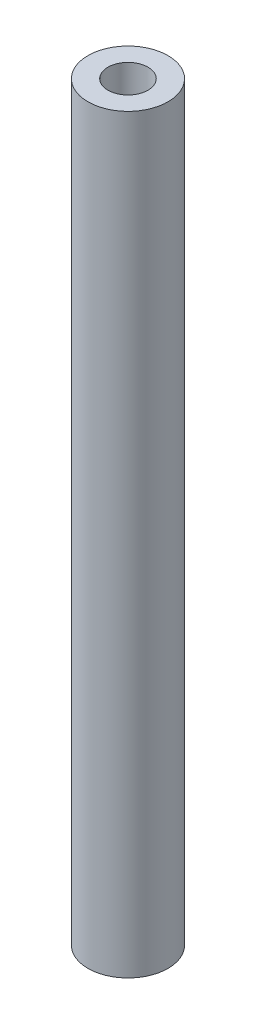
ISO-10303-21;
HEADER;
FILE_DESCRIPTION(('STEP AP214'),'2;1');
FILE_NAME('part.step','',(''),(''),'','','');
FILE_SCHEMA(('AUTOMOTIVE_DESIGN { 1 0 10303 214 1 1 1 1 }'));
ENDSEC;
DATA;
#1=APPLICATION_CONTEXT('core data for automotive mechanical design processes');
#2=APPLICATION_PROTOCOL_DEFINITION('international standard','automotive_design',2000,#1);
#3=PRODUCT_CONTEXT('',#1,'mechanical');
#4=PRODUCT('Part','Part','',(#3));
#5=PRODUCT_RELATED_PRODUCT_CATEGORY('part','',(#4));
#6=PRODUCT_DEFINITION_FORMATION('','',#4);
#7=PRODUCT_DEFINITION_CONTEXT('part definition',#1,'design');
#8=PRODUCT_DEFINITION('design','',#6,#7);
#9=PRODUCT_DEFINITION_SHAPE('','',#8);
#10=(LENGTH_UNIT() NAMED_UNIT(*) SI_UNIT(.MILLI.,.METRE.));
#11=(NAMED_UNIT(*) PLANE_ANGLE_UNIT() SI_UNIT($,.RADIAN.));
#12=(NAMED_UNIT(*) SI_UNIT($,.STERADIAN.) SOLID_ANGLE_UNIT());
#13=UNCERTAINTY_MEASURE_WITH_UNIT(LENGTH_MEASURE(1.E-05),#10,'distance_accuracy_value','');
#14=(GEOMETRIC_REPRESENTATION_CONTEXT(3) GLOBAL_UNCERTAINTY_ASSIGNED_CONTEXT((#13)) GLOBAL_UNIT_ASSIGNED_CONTEXT((#10,
#11,#12)) REPRESENTATION_CONTEXT('',''));
#15=CARTESIAN_POINT('',(0.,0.,0.));
#16=DIRECTION('',(0.,0.,1.));
#17=DIRECTION('',(1.,0.,0.));
#18=AXIS2_PLACEMENT_3D('',#15,#16,#17);
#19=CARTESIAN_POINT('',(0.,37.5,0.));
#20=DIRECTION('',(0.,-1.,0.));
#21=DIRECTION('',(0.,0.,-1.));
#22=AXIS2_PLACEMENT_3D('',#19,#20,#21);
#23=CYLINDRICAL_SURFACE('',#22,4.);
#24=CARTESIAN_POINT('',(0.,37.5,0.));
#25=DIRECTION('',(0.,1.,0.));
#26=DIRECTION('',(0.,0.,1.));
#27=AXIS2_PLACEMENT_3D('',#24,#25,#26);
#28=CIRCLE('',#27,4.);
#29=CARTESIAN_POINT('',(0.,37.5,4.));
#30=VERTEX_POINT('',#29);
#31=EDGE_CURVE('E10',#30,#30,#28,.T.);
#32=ORIENTED_EDGE('',*,*,#31,.F.);
#33=EDGE_LOOP('',(#32));
#34=FACE_BOUND('',#33,.T.);
#35=CARTESIAN_POINT('',(0.,-37.5,0.));
#36=DIRECTION('',(0.,1.,0.));
#37=DIRECTION('',(0.,0.,1.));
#38=AXIS2_PLACEMENT_3D('',#35,#36,#37);
#39=CIRCLE('',#38,4.);
#40=CARTESIAN_POINT('',(0.,-37.5,4.));
#41=VERTEX_POINT('',#40);
#42=EDGE_CURVE('E37',#41,#41,#39,.T.);
#43=ORIENTED_EDGE('',*,*,#42,.T.);
#44=EDGE_LOOP('',(#43));
#45=FACE_BOUND('',#44,.T.);
#46=ADVANCED_FACE('F34',(#34,#45),#23,.T.);
#47=CARTESIAN_POINT('',(0.,37.5,0.));
#48=DIRECTION('',(0.,1.,0.));
#49=DIRECTION('',(0.,0.,1.));
#50=AXIS2_PLACEMENT_3D('',#47,#48,#49);
#51=PLANE('',#50);
#52=CARTESIAN_POINT('',(0.,37.5,0.));
#53=DIRECTION('',(0.,1.,0.));
#54=DIRECTION('',(0.,0.,1.));
#55=AXIS2_PLACEMENT_3D('',#52,#53,#54);
#56=CIRCLE('',#55,2.);
#57=CARTESIAN_POINT('',(0.,37.5,2.));
#58=VERTEX_POINT('',#57);
#59=EDGE_CURVE('E46',#58,#58,#56,.T.);
#60=ORIENTED_EDGE('',*,*,#59,.F.);
#61=EDGE_LOOP('',(#60));
#62=FACE_BOUND('',#61,.T.);
#63=ORIENTED_EDGE('',*,*,#31,.T.);
#64=EDGE_LOOP('',(#63));
#65=FACE_BOUND('',#64,.T.);
#66=ADVANCED_FACE('F71',(#62,#65),#51,.T.);
#67=CARTESIAN_POINT('',(0.,-37.5,0.));
#68=DIRECTION('',(0.,1.,0.));
#69=DIRECTION('',(0.,0.,1.));
#70=AXIS2_PLACEMENT_3D('',#67,#68,#69);
#71=PLANE('',#70);
#72=CARTESIAN_POINT('',(0.,-37.5,0.));
#73=DIRECTION('',(0.,-1.,0.));
#74=DIRECTION('',(0.,0.,-1.));
#75=AXIS2_PLACEMENT_3D('',#72,#73,#74);
#76=CIRCLE('',#75,2.);
#77=CARTESIAN_POINT('',(0.,-37.5,-2.));
#78=VERTEX_POINT('',#77);
#79=EDGE_CURVE('E52',#78,#78,#76,.T.);
#80=ORIENTED_EDGE('',*,*,#79,.F.);
#81=EDGE_LOOP('',(#80));
#82=FACE_BOUND('',#81,.T.);
#83=ORIENTED_EDGE('',*,*,#42,.F.);
#84=EDGE_LOOP('',(#83));
#85=FACE_BOUND('',#84,.T.);
#86=ADVANCED_FACE('F67',(#82,#85),#71,.F.);
#87=CARTESIAN_POINT('',(0.,33.5,0.));
#88=DIRECTION('',(0.,1.,0.));
#89=DIRECTION('',(0.,0.,1.));
#90=AXIS2_PLACEMENT_3D('',#87,#88,#89);
#91=CYLINDRICAL_SURFACE('',#90,2.);
#92=CARTESIAN_POINT('',(0.,33.5,0.));
#93=DIRECTION('',(0.,1.,0.));
#94=DIRECTION('',(0.,0.,1.));
#95=AXIS2_PLACEMENT_3D('',#92,#93,#94);
#96=CIRCLE('',#95,2.);
#97=CARTESIAN_POINT('',(0.,33.5,2.));
#98=VERTEX_POINT('',#97);
#99=EDGE_CURVE('E44',#98,#98,#96,.T.);
#100=ORIENTED_EDGE('',*,*,#99,.F.);
#101=EDGE_LOOP('',(#100));
#102=FACE_BOUND('',#101,.T.);
#103=ORIENTED_EDGE('',*,*,#59,.T.);
#104=EDGE_LOOP('',(#103));
#105=FACE_BOUND('',#104,.T.);
#106=ADVANCED_FACE('F70',(#102,#105),#91,.F.);
#107=CARTESIAN_POINT('',(0.,33.5,0.));
#108=DIRECTION('',(0.,1.,0.));
#109=DIRECTION('',(0.,0.,1.));
#110=AXIS2_PLACEMENT_3D('',#107,#108,#109);
#111=PLANE('',#110);
#112=ORIENTED_EDGE('',*,*,#99,.T.);
#113=EDGE_LOOP('',(#112));
#114=FACE_BOUND('',#113,.T.);
#115=ADVANCED_FACE('F63',(#114),#111,.T.);
#116=CARTESIAN_POINT('',(0.,-33.5,0.));
#117=DIRECTION('',(0.,-1.,0.));
#118=DIRECTION('',(0.,0.,-1.));
#119=AXIS2_PLACEMENT_3D('',#116,#117,#118);
#120=CYLINDRICAL_SURFACE('',#119,2.);
#121=CARTESIAN_POINT('',(0.,-33.5,0.));
#122=DIRECTION('',(0.,-1.,0.));
#123=DIRECTION('',(0.,0.,-1.));
#124=AXIS2_PLACEMENT_3D('',#121,#122,#123);
#125=CIRCLE('',#124,2.);
#126=CARTESIAN_POINT('',(0.,-33.5,-2.));
#127=VERTEX_POINT('',#126);
#128=EDGE_CURVE('E49',#127,#127,#125,.T.);
#129=ORIENTED_EDGE('',*,*,#128,.F.);
#130=EDGE_LOOP('',(#129));
#131=FACE_BOUND('',#130,.T.);
#132=ORIENTED_EDGE('',*,*,#79,.T.);
#133=EDGE_LOOP('',(#132));
#134=FACE_BOUND('',#133,.T.);
#135=ADVANCED_FACE('F60',(#131,#134),#120,.F.);
#136=CARTESIAN_POINT('',(0.,-33.5,0.));
#137=DIRECTION('',(0.,-1.,0.));
#138=DIRECTION('',(0.,0.,-1.));
#139=AXIS2_PLACEMENT_3D('',#136,#137,#138);
#140=PLANE('',#139);
#141=ORIENTED_EDGE('',*,*,#128,.T.);
#142=EDGE_LOOP('',(#141));
#143=FACE_BOUND('',#142,.T.);
#144=ADVANCED_FACE('F58',(#143),#140,.T.);
#145=CLOSED_SHELL('',(#46,#66,#86,#106,#115,#135,#144));
#146=MANIFOLD_SOLID_BREP('B2',#145);
#147=ADVANCED_BREP_SHAPE_REPRESENTATION('',(#18,#146),#14);
#148=SHAPE_DEFINITION_REPRESENTATION(#9,#147);
ENDSEC;
END-ISO-10303-21;
